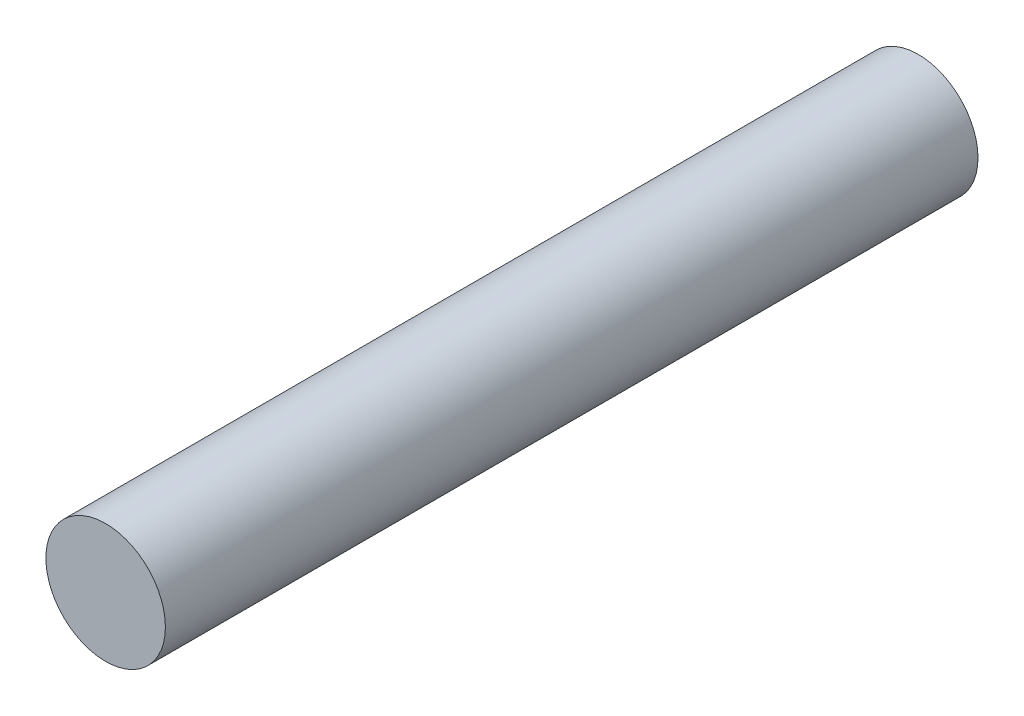
ISO-10303-21;
HEADER;
FILE_DESCRIPTION(('STEP AP214'),'2;1');
FILE_NAME('part.step','',(''),(''),'','','');
FILE_SCHEMA(('AUTOMOTIVE_DESIGN { 1 0 10303 214 1 1 1 1 }'));
ENDSEC;
DATA;
#1=APPLICATION_CONTEXT('core data for automotive mechanical design processes');
#2=APPLICATION_PROTOCOL_DEFINITION('international standard','automotive_design',2000,#1);
#3=PRODUCT_CONTEXT('',#1,'mechanical');
#4=PRODUCT('Part','Part','',(#3));
#5=PRODUCT_RELATED_PRODUCT_CATEGORY('part','',(#4));
#6=PRODUCT_DEFINITION_FORMATION('','',#4);
#7=PRODUCT_DEFINITION_CONTEXT('part definition',#1,'design');
#8=PRODUCT_DEFINITION('design','',#6,#7);
#9=PRODUCT_DEFINITION_SHAPE('','',#8);
#10=(LENGTH_UNIT() NAMED_UNIT(*) SI_UNIT(.MILLI.,.METRE.));
#11=(NAMED_UNIT(*) PLANE_ANGLE_UNIT() SI_UNIT($,.RADIAN.));
#12=(NAMED_UNIT(*) SI_UNIT($,.STERADIAN.) SOLID_ANGLE_UNIT());
#13=UNCERTAINTY_MEASURE_WITH_UNIT(LENGTH_MEASURE(1.E-05),#10,'distance_accuracy_value','');
#14=(GEOMETRIC_REPRESENTATION_CONTEXT(3) GLOBAL_UNCERTAINTY_ASSIGNED_CONTEXT((#13)) GLOBAL_UNIT_ASSIGNED_CONTEXT((#10,
#11,#12)) REPRESENTATION_CONTEXT('',''));
#15=CARTESIAN_POINT('',(0.,0.,0.));
#16=DIRECTION('',(0.,0.,1.));
#17=DIRECTION('',(1.,0.,0.));
#18=AXIS2_PLACEMENT_3D('',#15,#16,#17);
#19=CARTESIAN_POINT('',(-40.983162755083,47.5012018164023,34.));
#20=DIRECTION('',(0.,0.,-1.));
#21=DIRECTION('',(-1.,0.,0.));
#22=AXIS2_PLACEMENT_3D('',#19,#20,#21);
#23=CYLINDRICAL_SURFACE('',#22,2.5);
#24=CARTESIAN_POINT('',(-40.983162755083,47.5012018164023,34.));
#25=DIRECTION('',(0.,0.,1.));
#26=DIRECTION('',(1.,0.,0.));
#27=AXIS2_PLACEMENT_3D('',#24,#25,#26);
#28=CIRCLE('',#27,2.5);
#29=CARTESIAN_POINT('',(-38.483162755083,47.5012018164023,34.));
#30=VERTEX_POINT('',#29);
#31=EDGE_CURVE('E10',#30,#30,#28,.T.);
#32=ORIENTED_EDGE('',*,*,#31,.F.);
#33=EDGE_LOOP('',(#32));
#34=FACE_BOUND('',#33,.T.);
#35=CARTESIAN_POINT('',(-40.983162755083,47.5012018164023,0.));
#36=DIRECTION('',(0.,0.,1.));
#37=DIRECTION('',(1.,0.,0.));
#38=AXIS2_PLACEMENT_3D('',#35,#36,#37);
#39=CIRCLE('',#38,2.5);
#40=CARTESIAN_POINT('',(-38.483162755083,47.5012018164023,0.));
#41=VERTEX_POINT('',#40);
#42=EDGE_CURVE('E38',#41,#41,#39,.T.);
#43=ORIENTED_EDGE('',*,*,#42,.T.);
#44=EDGE_LOOP('',(#43));
#45=FACE_BOUND('',#44,.T.);
#46=ADVANCED_FACE('F35',(#34,#45),#23,.T.);
#47=CARTESIAN_POINT('',(-40.983162755083,47.5012018164023,34.));
#48=DIRECTION('',(0.,0.,1.));
#49=DIRECTION('',(1.,0.,0.));
#50=AXIS2_PLACEMENT_3D('',#47,#48,#49);
#51=PLANE('',#50);
#52=ORIENTED_EDGE('',*,*,#31,.T.);
#53=EDGE_LOOP('',(#52));
#54=FACE_BOUND('',#53,.T.);
#55=ADVANCED_FACE('F50',(#54),#51,.T.);
#56=CARTESIAN_POINT('',(-40.983162755083,47.5012018164023,0.));
#57=DIRECTION('',(0.,0.,1.));
#58=DIRECTION('',(1.,0.,0.));
#59=AXIS2_PLACEMENT_3D('',#56,#57,#58);
#60=PLANE('',#59);
#61=ORIENTED_EDGE('',*,*,#42,.F.);
#62=EDGE_LOOP('',(#61));
#63=FACE_BOUND('',#62,.T.);
#64=ADVANCED_FACE('F48',(#63),#60,.F.);
#65=CLOSED_SHELL('',(#46,#55,#64));
#66=MANIFOLD_SOLID_BREP('B2',#65);
#67=ADVANCED_BREP_SHAPE_REPRESENTATION('',(#18,#66),#14);
#68=SHAPE_DEFINITION_REPRESENTATION(#9,#67);
ENDSEC;
END-ISO-10303-21;
